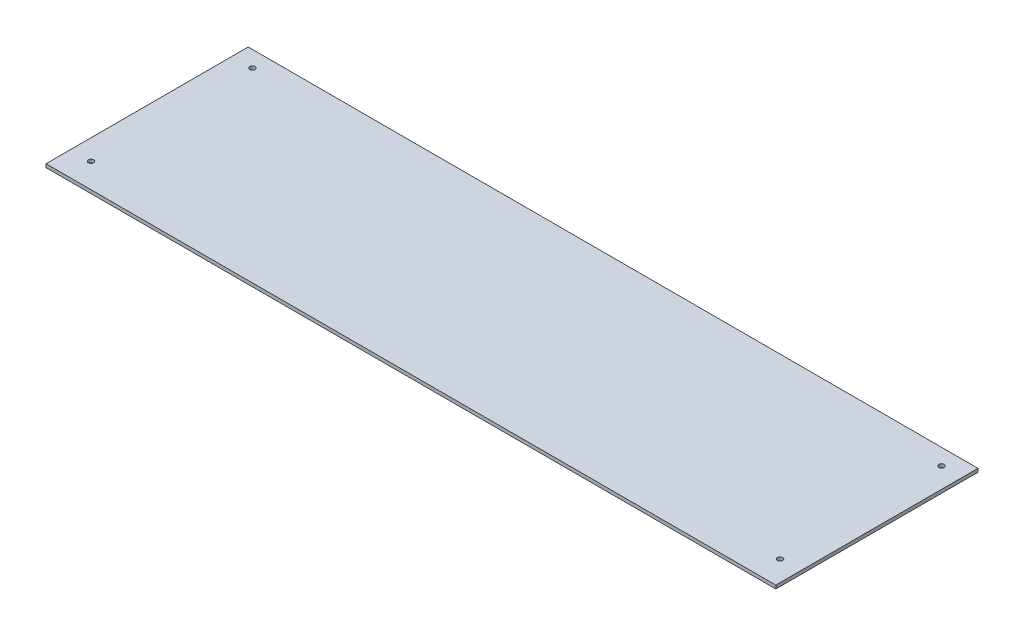
ISO-10303-21;
HEADER;
FILE_DESCRIPTION(('STEP AP214'),'2;1');
FILE_NAME('part.step','',(''),(''),'','','');
FILE_SCHEMA(('AUTOMOTIVE_DESIGN { 1 0 10303 214 1 1 1 1 }'));
ENDSEC;
DATA;
#1=APPLICATION_CONTEXT('core data for automotive mechanical design processes');
#2=APPLICATION_PROTOCOL_DEFINITION('international standard','automotive_design',2000,#1);
#3=PRODUCT_CONTEXT('',#1,'mechanical');
#4=PRODUCT('Part','Part','',(#3));
#5=PRODUCT_RELATED_PRODUCT_CATEGORY('part','',(#4));
#6=PRODUCT_DEFINITION_FORMATION('','',#4);
#7=PRODUCT_DEFINITION_CONTEXT('part definition',#1,'design');
#8=PRODUCT_DEFINITION('design','',#6,#7);
#9=PRODUCT_DEFINITION_SHAPE('','',#8);
#10=(LENGTH_UNIT() NAMED_UNIT(*) SI_UNIT(.MILLI.,.METRE.));
#11=(NAMED_UNIT(*) PLANE_ANGLE_UNIT() SI_UNIT($,.RADIAN.));
#12=(NAMED_UNIT(*) SI_UNIT($,.STERADIAN.) SOLID_ANGLE_UNIT());
#13=UNCERTAINTY_MEASURE_WITH_UNIT(LENGTH_MEASURE(1.E-05),#10,'distance_accuracy_value','');
#14=(GEOMETRIC_REPRESENTATION_CONTEXT(3) GLOBAL_UNCERTAINTY_ASSIGNED_CONTEXT((#13)) GLOBAL_UNIT_ASSIGNED_CONTEXT((#10,
#11,#12)) REPRESENTATION_CONTEXT('',''));
#15=CARTESIAN_POINT('',(0.,0.,0.));
#16=DIRECTION('',(0.,0.,1.));
#17=DIRECTION('',(1.,0.,0.));
#18=AXIS2_PLACEMENT_3D('',#15,#16,#17);
#19=CARTESIAN_POINT('',(0.,2.,0.));
#20=DIRECTION('',(0.,-1.,0.));
#21=DIRECTION('',(0.,0.,-1.));
#22=AXIS2_PLACEMENT_3D('',#19,#20,#21);
#23=PLANE('',#22);
#24=CARTESIAN_POINT('',(418.,2.,-110.));
#25=DIRECTION('',(0.,1.,0.));
#26=DIRECTION('',(0.,0.,-1.));
#27=AXIS2_PLACEMENT_3D('',#24,#25,#26);
#28=CIRCLE('',#27,1.54999999999999);
#29=CARTESIAN_POINT('',(418.,2.,-111.55));
#30=VERTEX_POINT('',#29);
#31=EDGE_CURVE('E104',#30,#30,#28,.T.);
#32=ORIENTED_EDGE('',*,*,#31,.F.);
#33=EDGE_LOOP('',(#32));
#34=FACE_BOUND('',#33,.T.);
#35=CARTESIAN_POINT('',(418.,2.,-15.));
#36=DIRECTION('',(0.,1.,0.));
#37=DIRECTION('',(0.,0.,-1.));
#38=AXIS2_PLACEMENT_3D('',#35,#36,#37);
#39=CIRCLE('',#38,1.54999999999999);
#40=CARTESIAN_POINT('',(418.,2.,-16.55));
#41=VERTEX_POINT('',#40);
#42=EDGE_CURVE('E112',#41,#41,#39,.T.);
#43=ORIENTED_EDGE('',*,*,#42,.F.);
#44=EDGE_LOOP('',(#43));
#45=FACE_BOUND('',#44,.T.);
#46=CARTESIAN_POINT('',(12.5,2.,-110.));
#47=DIRECTION('',(0.,1.,0.));
#48=DIRECTION('',(0.,0.,1.));
#49=AXIS2_PLACEMENT_3D('',#46,#47,#48);
#50=CIRCLE('',#49,1.54999999999999);
#51=CARTESIAN_POINT('',(12.5,2.,-108.45));
#52=VERTEX_POINT('',#51);
#53=EDGE_CURVE('E118',#52,#52,#50,.T.);
#54=ORIENTED_EDGE('',*,*,#53,.F.);
#55=EDGE_LOOP('',(#54));
#56=FACE_BOUND('',#55,.T.);
#57=CARTESIAN_POINT('',(12.5,2.,-15.));
#58=DIRECTION('',(0.,1.,0.));
#59=DIRECTION('',(0.,0.,1.));
#60=AXIS2_PLACEMENT_3D('',#57,#58,#59);
#61=CIRCLE('',#60,1.55);
#62=CARTESIAN_POINT('',(12.5,2.,-13.45));
#63=VERTEX_POINT('',#62);
#64=EDGE_CURVE('E11',#63,#63,#61,.T.);
#65=ORIENTED_EDGE('',*,*,#64,.F.);
#66=EDGE_LOOP('',(#65));
#67=FACE_BOUND('',#66,.T.);
#68=DIRECTION('',(1.,0.,0.));
#69=VECTOR('',#68,1.);
#70=CARTESIAN_POINT('',(430.,2.,-0.499999999999994));
#71=LINE('',#70,#69);
#72=CARTESIAN_POINT('',(0.5,2.,-0.5));
#73=VERTEX_POINT('',#72);
#74=CARTESIAN_POINT('',(430.,2.00000000000011,-0.499999999999994));
#75=VERTEX_POINT('',#74);
#76=EDGE_CURVE('E77',#73,#75,#71,.T.);
#77=ORIENTED_EDGE('',*,*,#76,.T.);
#78=DIRECTION('',(0.,0.,-1.));
#79=VECTOR('',#78,1.);
#80=CARTESIAN_POINT('',(430.,2.,-119.5));
#81=LINE('',#80,#79);
#82=CARTESIAN_POINT('',(430.,2.,-119.5));
#83=VERTEX_POINT('',#82);
#84=EDGE_CURVE('E103',#75,#83,#81,.T.);
#85=ORIENTED_EDGE('',*,*,#84,.T.);
#86=DIRECTION('',(-1.,0.,0.));
#87=VECTOR('',#86,1.);
#88=CARTESIAN_POINT('',(0.5,2.,-119.5));
#89=LINE('',#88,#87);
#90=CARTESIAN_POINT('',(0.5,2.,-119.5));
#91=VERTEX_POINT('',#90);
#92=EDGE_CURVE('E157',#83,#91,#89,.T.);
#93=ORIENTED_EDGE('',*,*,#92,.T.);
#94=DIRECTION('',(0.,0.,1.));
#95=VECTOR('',#94,1.);
#96=CARTESIAN_POINT('',(0.5,2.,-0.5));
#97=LINE('',#96,#95);
#98=EDGE_CURVE('E111',#91,#73,#97,.T.);
#99=ORIENTED_EDGE('',*,*,#98,.T.);
#100=EDGE_LOOP('',(#77,#85,#93,#99));
#101=FACE_BOUND('',#100,.T.);
#102=ADVANCED_FACE('F33',(#34,#45,#56,#67,#101),#23,.F.);
#103=CARTESIAN_POINT('',(0.,0.,0.));
#104=DIRECTION('',(0.,-1.,0.));
#105=DIRECTION('',(0.,0.,-1.));
#106=AXIS2_PLACEMENT_3D('',#103,#104,#105);
#107=PLANE('',#106);
#108=CARTESIAN_POINT('',(418.,0.,-110.));
#109=DIRECTION('',(0.,1.,0.));
#110=DIRECTION('',(0.,0.,-1.));
#111=AXIS2_PLACEMENT_3D('',#108,#109,#110);
#112=CIRCLE('',#111,1.54999999999999);
#113=CARTESIAN_POINT('',(418.,0.,-111.55));
#114=VERTEX_POINT('',#113);
#115=EDGE_CURVE('E108',#114,#114,#112,.T.);
#116=ORIENTED_EDGE('',*,*,#115,.T.);
#117=EDGE_LOOP('',(#116));
#118=FACE_BOUND('',#117,.T.);
#119=CARTESIAN_POINT('',(12.5,0.,-110.));
#120=DIRECTION('',(0.,1.,0.));
#121=DIRECTION('',(0.,0.,1.));
#122=AXIS2_PLACEMENT_3D('',#119,#120,#121);
#123=CIRCLE('',#122,1.54999999999999);
#124=CARTESIAN_POINT('',(12.5,0.,-108.45));
#125=VERTEX_POINT('',#124);
#126=EDGE_CURVE('E115',#125,#125,#123,.T.);
#127=ORIENTED_EDGE('',*,*,#126,.T.);
#128=EDGE_LOOP('',(#127));
#129=FACE_BOUND('',#128,.T.);
#130=CARTESIAN_POINT('',(12.5,0.,-15.));
#131=DIRECTION('',(0.,1.,0.));
#132=DIRECTION('',(0.,0.,1.));
#133=AXIS2_PLACEMENT_3D('',#130,#131,#132);
#134=CIRCLE('',#133,1.55);
#135=CARTESIAN_POINT('',(12.5,0.,-13.45));
#136=VERTEX_POINT('',#135);
#137=EDGE_CURVE('E37',#136,#136,#134,.T.);
#138=ORIENTED_EDGE('',*,*,#137,.T.);
#139=EDGE_LOOP('',(#138));
#140=FACE_BOUND('',#139,.T.);
#141=CARTESIAN_POINT('',(418.,0.,-15.));
#142=DIRECTION('',(0.,1.,0.));
#143=DIRECTION('',(0.,0.,-1.));
#144=AXIS2_PLACEMENT_3D('',#141,#142,#143);
#145=CIRCLE('',#144,1.54999999999999);
#146=CARTESIAN_POINT('',(418.,0.,-16.55));
#147=VERTEX_POINT('',#146);
#148=EDGE_CURVE('E107',#147,#147,#145,.T.);
#149=ORIENTED_EDGE('',*,*,#148,.T.);
#150=EDGE_LOOP('',(#149));
#151=FACE_BOUND('',#150,.T.);
#152=DIRECTION('',(0.,0.,1.));
#153=VECTOR('',#152,1.);
#154=CARTESIAN_POINT('',(430.,0.,-119.5));
#155=LINE('',#154,#153);
#156=CARTESIAN_POINT('',(430.,0.,-119.5));
#157=VERTEX_POINT('',#156);
#158=CARTESIAN_POINT('',(430.,0.,-0.499999999999994));
#159=VERTEX_POINT('',#158);
#160=EDGE_CURVE('E93',#157,#159,#155,.T.);
#161=ORIENTED_EDGE('',*,*,#160,.T.);
#162=DIRECTION('',(-1.,0.,0.));
#163=VECTOR('',#162,1.);
#164=CARTESIAN_POINT('',(430.,0.,-0.499999999999994));
#165=LINE('',#164,#163);
#166=CARTESIAN_POINT('',(0.5,0.,-0.5));
#167=VERTEX_POINT('',#166);
#168=EDGE_CURVE('E56',#159,#167,#165,.T.);
#169=ORIENTED_EDGE('',*,*,#168,.T.);
#170=DIRECTION('',(0.,0.,-1.));
#171=VECTOR('',#170,1.);
#172=CARTESIAN_POINT('',(0.5,0.,-0.5));
#173=LINE('',#172,#171);
#174=CARTESIAN_POINT('',(0.5,0.,-119.5));
#175=VERTEX_POINT('',#174);
#176=EDGE_CURVE('E84',#167,#175,#173,.T.);
#177=ORIENTED_EDGE('',*,*,#176,.T.);
#178=DIRECTION('',(1.,0.,0.));
#179=VECTOR('',#178,1.);
#180=CARTESIAN_POINT('',(0.5,0.,-119.5));
#181=LINE('',#180,#179);
#182=EDGE_CURVE('E90',#175,#157,#181,.T.);
#183=ORIENTED_EDGE('',*,*,#182,.T.);
#184=EDGE_LOOP('',(#161,#169,#177,#183));
#185=FACE_BOUND('',#184,.T.);
#186=ADVANCED_FACE('F35',(#118,#129,#140,#151,#185),#107,.T.);
#187=CARTESIAN_POINT('',(12.5,2.,-15.));
#188=DIRECTION('',(0.,-1.,0.));
#189=DIRECTION('',(0.,0.,-1.));
#190=AXIS2_PLACEMENT_3D('',#187,#188,#189);
#191=CYLINDRICAL_SURFACE('',#190,1.55);
#192=ORIENTED_EDGE('',*,*,#64,.T.);
#193=EDGE_LOOP('',(#192));
#194=FACE_BOUND('',#193,.T.);
#195=ORIENTED_EDGE('',*,*,#137,.F.);
#196=EDGE_LOOP('',(#195));
#197=FACE_BOUND('',#196,.T.);
#198=ADVANCED_FACE('F129',(#194,#197),#191,.F.);
#199=CARTESIAN_POINT('',(12.5,2.,-110.));
#200=DIRECTION('',(0.,-1.,0.));
#201=DIRECTION('',(0.,0.,-1.));
#202=AXIS2_PLACEMENT_3D('',#199,#200,#201);
#203=CYLINDRICAL_SURFACE('',#202,1.54999999999999);
#204=ORIENTED_EDGE('',*,*,#53,.T.);
#205=EDGE_LOOP('',(#204));
#206=FACE_BOUND('',#205,.T.);
#207=ORIENTED_EDGE('',*,*,#126,.F.);
#208=EDGE_LOOP('',(#207));
#209=FACE_BOUND('',#208,.T.);
#210=ADVANCED_FACE('F126',(#206,#209),#203,.F.);
#211=CARTESIAN_POINT('',(418.,2.,-15.));
#212=DIRECTION('',(0.,-1.,0.));
#213=DIRECTION('',(0.,0.,-1.));
#214=AXIS2_PLACEMENT_3D('',#211,#212,#213);
#215=CYLINDRICAL_SURFACE('',#214,1.54999999999999);
#216=ORIENTED_EDGE('',*,*,#42,.T.);
#217=EDGE_LOOP('',(#216));
#218=FACE_BOUND('',#217,.T.);
#219=ORIENTED_EDGE('',*,*,#148,.F.);
#220=EDGE_LOOP('',(#219));
#221=FACE_BOUND('',#220,.T.);
#222=ADVANCED_FACE('F128',(#218,#221),#215,.F.);
#223=CARTESIAN_POINT('',(418.,2.,-110.));
#224=DIRECTION('',(0.,-1.,0.));
#225=DIRECTION('',(0.,0.,-1.));
#226=AXIS2_PLACEMENT_3D('',#223,#224,#225);
#227=CYLINDRICAL_SURFACE('',#226,1.54999999999999);
#228=ORIENTED_EDGE('',*,*,#31,.T.);
#229=EDGE_LOOP('',(#228));
#230=FACE_BOUND('',#229,.T.);
#231=ORIENTED_EDGE('',*,*,#115,.F.);
#232=EDGE_LOOP('',(#231));
#233=FACE_BOUND('',#232,.T.);
#234=ADVANCED_FACE('F136',(#230,#233),#227,.F.);
#235=CARTESIAN_POINT('',(430.,448.91190407059,-0.499999999999994));
#236=DIRECTION('',(0.,0.,1.));
#237=DIRECTION('',(1.,0.,0.));
#238=AXIS2_PLACEMENT_3D('',#235,#236,#237);
#239=PLANE('',#238);
#240=DIRECTION('',(0.,-1.,0.));
#241=VECTOR('',#240,1.);
#242=CARTESIAN_POINT('',(0.5,448.91190407059,-0.5));
#243=LINE('',#242,#241);
#244=EDGE_CURVE('E73',#73,#167,#243,.T.);
#245=ORIENTED_EDGE('',*,*,#244,.T.);
#246=ORIENTED_EDGE('',*,*,#168,.F.);
#247=DIRECTION('',(0.,-1.,0.));
#248=VECTOR('',#247,1.);
#249=CARTESIAN_POINT('',(430.,448.91190407059,-0.499999999999994));
#250=LINE('',#249,#248);
#251=EDGE_CURVE('E81',#75,#159,#250,.T.);
#252=ORIENTED_EDGE('',*,*,#251,.F.);
#253=ORIENTED_EDGE('',*,*,#76,.F.);
#254=EDGE_LOOP('',(#245,#246,#252,#253));
#255=FACE_BOUND('',#254,.T.);
#256=ADVANCED_FACE('F75',(#255),#239,.T.);
#257=CARTESIAN_POINT('',(0.5,448.91190407059,-0.5));
#258=DIRECTION('',(-1.,0.,0.));
#259=DIRECTION('',(0.,0.,1.));
#260=AXIS2_PLACEMENT_3D('',#257,#258,#259);
#261=PLANE('',#260);
#262=DIRECTION('',(0.,-1.,0.));
#263=VECTOR('',#262,1.);
#264=CARTESIAN_POINT('',(0.5,448.91190407059,-119.5));
#265=LINE('',#264,#263);
#266=EDGE_CURVE('E80',#91,#175,#265,.T.);
#267=ORIENTED_EDGE('',*,*,#266,.T.);
#268=ORIENTED_EDGE('',*,*,#176,.F.);
#269=ORIENTED_EDGE('',*,*,#244,.F.);
#270=ORIENTED_EDGE('',*,*,#98,.F.);
#271=EDGE_LOOP('',(#267,#268,#269,#270));
#272=FACE_BOUND('',#271,.T.);
#273=ADVANCED_FACE('F85',(#272),#261,.T.);
#274=CARTESIAN_POINT('',(0.5,448.91190407059,-119.5));
#275=DIRECTION('',(0.,0.,-1.));
#276=DIRECTION('',(-1.,0.,0.));
#277=AXIS2_PLACEMENT_3D('',#274,#275,#276);
#278=PLANE('',#277);
#279=DIRECTION('',(0.,-1.,0.));
#280=VECTOR('',#279,1.);
#281=CARTESIAN_POINT('',(430.,448.91190407059,-119.5));
#282=LINE('',#281,#280);
#283=EDGE_CURVE('E48',#83,#157,#282,.T.);
#284=ORIENTED_EDGE('',*,*,#283,.T.);
#285=ORIENTED_EDGE('',*,*,#182,.F.);
#286=ORIENTED_EDGE('',*,*,#266,.F.);
#287=ORIENTED_EDGE('',*,*,#92,.F.);
#288=EDGE_LOOP('',(#284,#285,#286,#287));
#289=FACE_BOUND('',#288,.T.);
#290=ADVANCED_FACE('F161',(#289),#278,.T.);
#291=CARTESIAN_POINT('',(430.,448.91190407059,-119.5));
#292=DIRECTION('',(1.,0.,0.));
#293=DIRECTION('',(0.,0.,-1.));
#294=AXIS2_PLACEMENT_3D('',#291,#292,#293);
#295=PLANE('',#294);
#296=ORIENTED_EDGE('',*,*,#251,.T.);
#297=ORIENTED_EDGE('',*,*,#160,.F.);
#298=ORIENTED_EDGE('',*,*,#283,.F.);
#299=ORIENTED_EDGE('',*,*,#84,.F.);
#300=EDGE_LOOP('',(#296,#297,#298,#299));
#301=FACE_BOUND('',#300,.T.);
#302=ADVANCED_FACE('F162',(#301),#295,.T.);
#303=CLOSED_SHELL('',(#102,#186,#198,#210,#222,#234,#256,#273,#290,#302));
#304=MANIFOLD_SOLID_BREP('B2',#303);
#305=ADVANCED_BREP_SHAPE_REPRESENTATION('',(#18,#304),#14);
#306=SHAPE_DEFINITION_REPRESENTATION(#9,#305);
ENDSEC;
END-ISO-10303-21;
